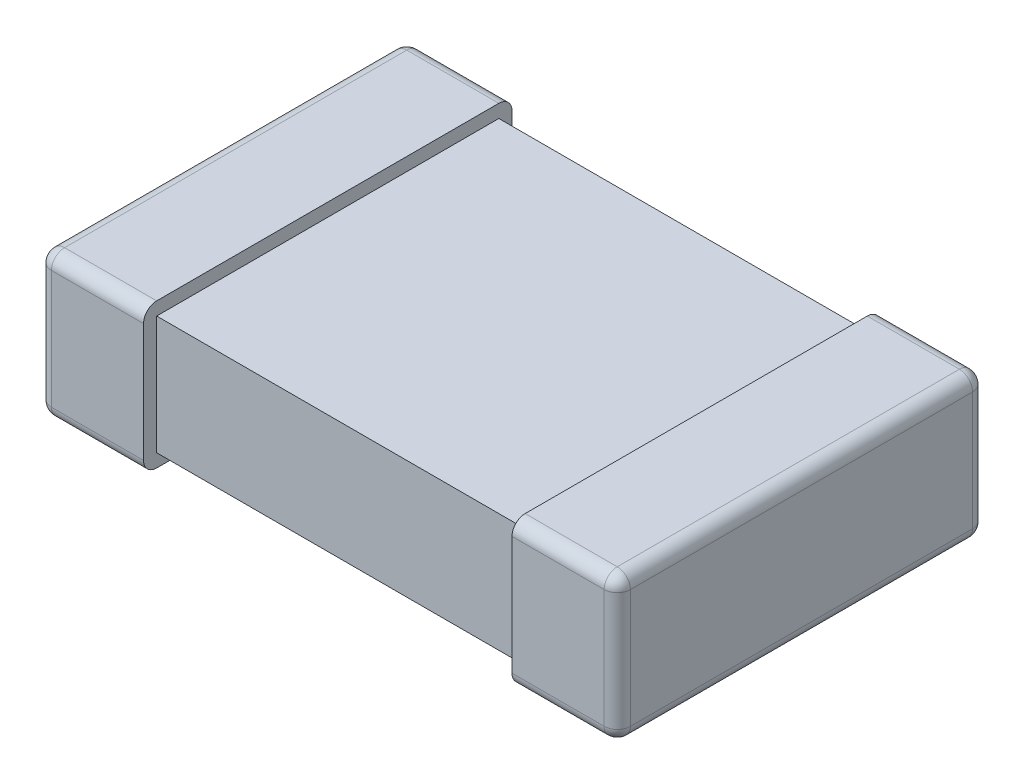
ISO-10303-21;
HEADER;
FILE_DESCRIPTION(('STEP AP214'),'2;1');
FILE_NAME('part.step','',(''),(''),'','','');
FILE_SCHEMA(('AUTOMOTIVE_DESIGN { 1 0 10303 214 1 1 1 1 }'));
ENDSEC;
DATA;
#1=APPLICATION_CONTEXT('core data for automotive mechanical design processes');
#2=APPLICATION_PROTOCOL_DEFINITION('international standard','automotive_design',2000,#1);
#3=PRODUCT_CONTEXT('',#1,'mechanical');
#4=PRODUCT('Part','Part','',(#3));
#5=PRODUCT_RELATED_PRODUCT_CATEGORY('part','',(#4));
#6=PRODUCT_DEFINITION_FORMATION('','',#4);
#7=PRODUCT_DEFINITION_CONTEXT('part definition',#1,'design');
#8=PRODUCT_DEFINITION('design','',#6,#7);
#9=PRODUCT_DEFINITION_SHAPE('','',#8);
#10=(LENGTH_UNIT() NAMED_UNIT(*) SI_UNIT(.MILLI.,.METRE.));
#11=(NAMED_UNIT(*) PLANE_ANGLE_UNIT() SI_UNIT($,.RADIAN.));
#12=(NAMED_UNIT(*) SI_UNIT($,.STERADIAN.) SOLID_ANGLE_UNIT());
#13=UNCERTAINTY_MEASURE_WITH_UNIT(LENGTH_MEASURE(1.E-05),#10,'distance_accuracy_value','');
#14=(GEOMETRIC_REPRESENTATION_CONTEXT(3) GLOBAL_UNCERTAINTY_ASSIGNED_CONTEXT((#13)) GLOBAL_UNIT_ASSIGNED_CONTEXT((#10,
#11,#12)) REPRESENTATION_CONTEXT('',''));
#15=CARTESIAN_POINT('',(0.,0.,0.));
#16=DIRECTION('',(0.,0.,1.));
#17=DIRECTION('',(1.,0.,0.));
#18=AXIS2_PLACEMENT_3D('',#15,#16,#17);
#19=CARTESIAN_POINT('',(1.1,0.55,-0.7));
#20=DIRECTION('',(1.,0.,0.));
#21=DIRECTION('',(0.,0.,-1.));
#22=AXIS2_PLACEMENT_3D('',#19,#20,#21);
#23=PLANE('',#22);
#24=DIRECTION('',(0.,0.,-1.));
#25=VECTOR('',#24,1.);
#26=CARTESIAN_POINT('',(1.1,0.05,-0.65));
#27=LINE('',#26,#25);
#28=CARTESIAN_POINT('',(1.1,0.05,-0.65));
#29=VERTEX_POINT('',#28);
#30=CARTESIAN_POINT('',(1.1,0.05,0.65));
#31=VERTEX_POINT('',#30);
#32=EDGE_CURVE('E675',#29,#31,#27,.F.);
#33=ORIENTED_EDGE('',*,*,#32,.F.);
#34=DIRECTION('',(0.,1.,0.));
#35=VECTOR('',#34,1.);
#36=CARTESIAN_POINT('',(1.1,0.55,-0.65));
#37=LINE('',#36,#35);
#38=CARTESIAN_POINT('',(1.1,0.5,-0.65));
#39=VERTEX_POINT('',#38);
#40=EDGE_CURVE('E676',#29,#39,#37,.T.);
#41=ORIENTED_EDGE('',*,*,#40,.T.);
#42=DIRECTION('',(0.,0.,1.));
#43=VECTOR('',#42,1.);
#44=CARTESIAN_POINT('',(1.1,0.5,-0.7));
#45=LINE('',#44,#43);
#46=CARTESIAN_POINT('',(1.1,0.5,0.65));
#47=VERTEX_POINT('',#46);
#48=EDGE_CURVE('E691',#47,#39,#45,.F.);
#49=ORIENTED_EDGE('',*,*,#48,.F.);
#50=DIRECTION('',(0.,-1.,0.));
#51=VECTOR('',#50,1.);
#52=CARTESIAN_POINT('',(1.1,0.55,0.65));
#53=LINE('',#52,#51);
#54=EDGE_CURVE('E460',#31,#47,#53,.F.);
#55=ORIENTED_EDGE('',*,*,#54,.F.);
#56=EDGE_LOOP('',(#33,#41,#49,#55));
#57=FACE_BOUND('',#56,.T.);
#58=ADVANCED_FACE('F16',(#57),#23,.T.);
#59=CARTESIAN_POINT('',(-1.1,0.55,-0.7));
#60=DIRECTION('',(1.,0.,0.));
#61=DIRECTION('',(0.,0.,-1.));
#62=AXIS2_PLACEMENT_3D('',#59,#60,#61);
#63=PLANE('',#62);
#64=DIRECTION('',(0.,0.,-1.));
#65=VECTOR('',#64,1.);
#66=CARTESIAN_POINT('',(-1.1,0.5,0.7));
#67=LINE('',#66,#65);
#68=CARTESIAN_POINT('',(-1.1,0.5,-0.65));
#69=VERTEX_POINT('',#68);
#70=CARTESIAN_POINT('',(-1.1,0.5,0.65));
#71=VERTEX_POINT('',#70);
#72=EDGE_CURVE('E409',#69,#71,#67,.F.);
#73=ORIENTED_EDGE('',*,*,#72,.F.);
#74=DIRECTION('',(0.,-1.,0.));
#75=VECTOR('',#74,1.);
#76=CARTESIAN_POINT('',(-1.1,0.55,-0.65));
#77=LINE('',#76,#75);
#78=CARTESIAN_POINT('',(-1.1,0.05,-0.65));
#79=VERTEX_POINT('',#78);
#80=EDGE_CURVE('E357',#79,#69,#77,.F.);
#81=ORIENTED_EDGE('',*,*,#80,.F.);
#82=DIRECTION('',(0.,0.,1.));
#83=VECTOR('',#82,1.);
#84=CARTESIAN_POINT('',(-1.1,0.05,-0.7));
#85=LINE('',#84,#83);
#86=CARTESIAN_POINT('',(-1.1,0.05,0.65));
#87=VERTEX_POINT('',#86);
#88=EDGE_CURVE('E665',#87,#79,#85,.F.);
#89=ORIENTED_EDGE('',*,*,#88,.F.);
#90=DIRECTION('',(0.,1.,0.));
#91=VECTOR('',#90,1.);
#92=CARTESIAN_POINT('',(-1.1,0.55,0.65));
#93=LINE('',#92,#91);
#94=EDGE_CURVE('E673',#71,#87,#93,.F.);
#95=ORIENTED_EDGE('',*,*,#94,.F.);
#96=EDGE_LOOP('',(#73,#81,#89,#95));
#97=FACE_BOUND('',#96,.T.);
#98=ADVANCED_FACE('F484',(#97),#63,.F.);
#99=CARTESIAN_POINT('',(1.05,0.05,-0.65));
#100=DIRECTION('',(0.,0.,-1.));
#101=DIRECTION('',(-1.,0.,0.));
#102=AXIS2_PLACEMENT_3D('',#99,#100,#101);
#103=CYLINDRICAL_SURFACE('',#102,0.05);
#104=CARTESIAN_POINT('',(1.05,0.05,0.65));
#105=DIRECTION('',(0.,0.,-1.));
#106=DIRECTION('',(1.,0.,0.));
#107=AXIS2_PLACEMENT_3D('',#104,#105,#106);
#108=CIRCLE('',#107,0.05);
#109=CARTESIAN_POINT('',(1.05,0.,0.65));
#110=VERTEX_POINT('',#109);
#111=EDGE_CURVE('E469',#110,#31,#108,.F.);
#112=ORIENTED_EDGE('',*,*,#111,.F.);
#113=DIRECTION('',(0.,0.,1.));
#114=VECTOR('',#113,1.);
#115=CARTESIAN_POINT('',(1.05,0.,-0.65));
#116=LINE('',#115,#114);
#117=CARTESIAN_POINT('',(1.05,0.,-0.650000000000096));
#118=VERTEX_POINT('',#117);
#119=EDGE_CURVE('E297',#110,#118,#116,.F.);
#120=ORIENTED_EDGE('',*,*,#119,.T.);
#121=CARTESIAN_POINT('',(1.05,0.05,-0.65));
#122=DIRECTION('',(0.,7.66568424341191E-12,-1.));
#123=DIRECTION('',(1.,0.,0.));
#124=AXIS2_PLACEMENT_3D('',#121,#122,#123);
#125=CIRCLE('',#124,0.05);
#126=EDGE_CURVE('E406',#29,#118,#125,.T.);
#127=ORIENTED_EDGE('',*,*,#126,.F.);
#128=ORIENTED_EDGE('',*,*,#32,.T.);
#129=EDGE_LOOP('',(#112,#120,#127,#128));
#130=FACE_BOUND('',#129,.T.);
#131=ADVANCED_FACE('F481',(#130),#103,.T.);
#132=CARTESIAN_POINT('',(1.05,0.05,0.65));
#133=DIRECTION('',(1.,0.,0.));
#134=DIRECTION('',(0.,0.,-1.));
#135=AXIS2_PLACEMENT_3D('',#132,#133,#134);
#136=SPHERICAL_SURFACE('',#135,0.05);
#137=ORIENTED_EDGE('',*,*,#111,.T.);
#138=CARTESIAN_POINT('',(1.05,0.05,0.65));
#139=DIRECTION('',(0.,-1.,0.));
#140=DIRECTION('',(0.,0.,-1.));
#141=AXIS2_PLACEMENT_3D('',#138,#139,#140);
#142=CIRCLE('',#141,0.05);
#143=CARTESIAN_POINT('',(1.05,0.05,0.7));
#144=VERTEX_POINT('',#143);
#145=EDGE_CURVE('E466',#144,#31,#142,.F.);
#146=ORIENTED_EDGE('',*,*,#145,.F.);
#147=CARTESIAN_POINT('',(1.05,0.05,0.65));
#148=DIRECTION('',(1.,0.,0.));
#149=DIRECTION('',(0.,0.,-1.));
#150=AXIS2_PLACEMENT_3D('',#147,#148,#149);
#151=CIRCLE('',#150,0.05);
#152=EDGE_CURVE('E187',#110,#144,#151,.F.);
#153=ORIENTED_EDGE('',*,*,#152,.F.);
#154=EDGE_LOOP('',(#137,#146,#153));
#155=FACE_BOUND('',#154,.T.);
#156=ADVANCED_FACE('F478',(#155),#136,.T.);
#157=CARTESIAN_POINT('',(1.05,0.55,0.65));
#158=DIRECTION('',(0.,-1.,0.));
#159=DIRECTION('',(0.,0.,-1.));
#160=AXIS2_PLACEMENT_3D('',#157,#158,#159);
#161=CYLINDRICAL_SURFACE('',#160,0.05);
#162=ORIENTED_EDGE('',*,*,#145,.T.);
#163=ORIENTED_EDGE('',*,*,#54,.T.);
#164=CARTESIAN_POINT('',(1.05,0.5,0.65));
#165=DIRECTION('',(0.,-1.,0.));
#166=DIRECTION('',(1.,0.,0.));
#167=AXIS2_PLACEMENT_3D('',#164,#165,#166);
#168=CIRCLE('',#167,0.05);
#169=CARTESIAN_POINT('',(1.05,0.5,0.7));
#170=VERTEX_POINT('',#169);
#171=EDGE_CURVE('E456',#170,#47,#168,.F.);
#172=ORIENTED_EDGE('',*,*,#171,.F.);
#173=DIRECTION('',(0.,1.,0.));
#174=VECTOR('',#173,1.);
#175=CARTESIAN_POINT('',(1.05,0.55,0.7));
#176=LINE('',#175,#174);
#177=EDGE_CURVE('E191',#144,#170,#176,.T.);
#178=ORIENTED_EDGE('',*,*,#177,.F.);
#179=EDGE_LOOP('',(#162,#163,#172,#178));
#180=FACE_BOUND('',#179,.T.);
#181=ADVANCED_FACE('F448',(#180),#161,.T.);
#182=CARTESIAN_POINT('',(1.05,0.5,0.65));
#183=DIRECTION('',(1.,0.,0.));
#184=DIRECTION('',(0.,0.,-1.));
#185=AXIS2_PLACEMENT_3D('',#182,#183,#184);
#186=SPHERICAL_SURFACE('',#185,0.05);
#187=CARTESIAN_POINT('',(1.05,0.5,0.65));
#188=DIRECTION('',(-1.,0.,0.));
#189=DIRECTION('',(0.,0.,1.));
#190=AXIS2_PLACEMENT_3D('',#187,#188,#189);
#191=CIRCLE('',#190,0.05);
#192=CARTESIAN_POINT('',(1.05,0.55,0.65));
#193=VERTEX_POINT('',#192);
#194=EDGE_CURVE('E291',#170,#193,#191,.T.);
#195=ORIENTED_EDGE('',*,*,#194,.F.);
#196=ORIENTED_EDGE('',*,*,#171,.T.);
#197=CARTESIAN_POINT('',(1.05,0.5,0.65));
#198=DIRECTION('',(0.,0.,1.));
#199=DIRECTION('',(1.,0.,0.));
#200=AXIS2_PLACEMENT_3D('',#197,#198,#199);
#201=CIRCLE('',#200,0.05);
#202=EDGE_CURVE('E459',#193,#47,#201,.F.);
#203=ORIENTED_EDGE('',*,*,#202,.F.);
#204=EDGE_LOOP('',(#195,#196,#203));
#205=FACE_BOUND('',#204,.T.);
#206=ADVANCED_FACE('F443',(#205),#186,.T.);
#207=CARTESIAN_POINT('',(1.05,0.5,-0.7));
#208=DIRECTION('',(0.,0.,1.));
#209=DIRECTION('',(1.,0.,0.));
#210=AXIS2_PLACEMENT_3D('',#207,#208,#209);
#211=CYLINDRICAL_SURFACE('',#210,0.05);
#212=ORIENTED_EDGE('',*,*,#202,.T.);
#213=ORIENTED_EDGE('',*,*,#48,.T.);
#214=CARTESIAN_POINT('',(1.05,0.5,-0.65));
#215=DIRECTION('',(0.,0.,1.));
#216=DIRECTION('',(1.,0.,0.));
#217=AXIS2_PLACEMENT_3D('',#214,#215,#216);
#218=CIRCLE('',#217,0.05);
#219=CARTESIAN_POINT('',(1.05,0.55,-0.65));
#220=VERTEX_POINT('',#219);
#221=EDGE_CURVE('E428',#220,#39,#218,.F.);
#222=ORIENTED_EDGE('',*,*,#221,.F.);
#223=DIRECTION('',(0.,0.,1.));
#224=VECTOR('',#223,1.);
#225=CARTESIAN_POINT('',(1.05,0.55,0.7));
#226=LINE('',#225,#224);
#227=EDGE_CURVE('E287',#193,#220,#226,.F.);
#228=ORIENTED_EDGE('',*,*,#227,.F.);
#229=EDGE_LOOP('',(#212,#213,#222,#228));
#230=FACE_BOUND('',#229,.T.);
#231=ADVANCED_FACE('F439',(#230),#211,.T.);
#232=CARTESIAN_POINT('',(1.05,0.5,-0.65));
#233=DIRECTION('',(1.,0.,0.));
#234=DIRECTION('',(0.,0.,-1.));
#235=AXIS2_PLACEMENT_3D('',#232,#233,#234);
#236=SPHERICAL_SURFACE('',#235,0.05);
#237=CARTESIAN_POINT('',(1.05,0.5,-0.65));
#238=DIRECTION('',(1.,0.,0.));
#239=DIRECTION('',(0.,0.,-1.));
#240=AXIS2_PLACEMENT_3D('',#237,#238,#239);
#241=CIRCLE('',#240,0.05);
#242=CARTESIAN_POINT('',(1.05,0.5,-0.7));
#243=VERTEX_POINT('',#242);
#244=EDGE_CURVE('E281',#220,#243,#241,.F.);
#245=ORIENTED_EDGE('',*,*,#244,.F.);
#246=ORIENTED_EDGE('',*,*,#221,.T.);
#247=CARTESIAN_POINT('',(1.05,0.5,-0.65));
#248=DIRECTION('',(0.,-1.,0.));
#249=DIRECTION('',(0.,0.,-1.));
#250=AXIS2_PLACEMENT_3D('',#247,#248,#249);
#251=CIRCLE('',#250,0.05);
#252=EDGE_CURVE('E415',#243,#39,#251,.T.);
#253=ORIENTED_EDGE('',*,*,#252,.F.);
#254=EDGE_LOOP('',(#245,#246,#253));
#255=FACE_BOUND('',#254,.T.);
#256=ADVANCED_FACE('F435',(#255),#236,.T.);
#257=CARTESIAN_POINT('',(1.05,0.55,-0.65));
#258=DIRECTION('',(0.,-1.,0.));
#259=DIRECTION('',(0.,0.,-1.));
#260=AXIS2_PLACEMENT_3D('',#257,#258,#259);
#261=CYLINDRICAL_SURFACE('',#260,0.05);
#262=ORIENTED_EDGE('',*,*,#252,.T.);
#263=ORIENTED_EDGE('',*,*,#40,.F.);
#264=CARTESIAN_POINT('',(1.05,0.05,-0.65));
#265=DIRECTION('',(0.,1.,0.));
#266=DIRECTION('',(1.,0.,0.));
#267=AXIS2_PLACEMENT_3D('',#264,#265,#266);
#268=CIRCLE('',#267,0.05);
#269=CARTESIAN_POINT('',(1.05,0.05,-0.7));
#270=VERTEX_POINT('',#269);
#271=EDGE_CURVE('E410',#270,#29,#268,.F.);
#272=ORIENTED_EDGE('',*,*,#271,.F.);
#273=DIRECTION('',(0.,1.,0.));
#274=VECTOR('',#273,1.);
#275=CARTESIAN_POINT('',(1.05,0.55,-0.7));
#276=LINE('',#275,#274);
#277=EDGE_CURVE('E275',#243,#270,#276,.F.);
#278=ORIENTED_EDGE('',*,*,#277,.F.);
#279=EDGE_LOOP('',(#262,#263,#272,#278));
#280=FACE_BOUND('',#279,.T.);
#281=ADVANCED_FACE('F438',(#280),#261,.T.);
#282=CARTESIAN_POINT('',(1.05,0.05,-0.65));
#283=DIRECTION('',(1.,0.,0.));
#284=DIRECTION('',(0.,0.,-1.));
#285=AXIS2_PLACEMENT_3D('',#282,#283,#284);
#286=SPHERICAL_SURFACE('',#285,0.05);
#287=ORIENTED_EDGE('',*,*,#271,.T.);
#288=ORIENTED_EDGE('',*,*,#126,.T.);
#289=CARTESIAN_POINT('',(1.05,0.05,-0.65));
#290=DIRECTION('',(-1.,0.,0.));
#291=DIRECTION('',(0.,0.,1.));
#292=AXIS2_PLACEMENT_3D('',#289,#290,#291);
#293=CIRCLE('',#292,0.05);
#294=EDGE_CURVE('E264',#270,#118,#293,.T.);
#295=ORIENTED_EDGE('',*,*,#294,.F.);
#296=EDGE_LOOP('',(#287,#288,#295));
#297=FACE_BOUND('',#296,.T.);
#298=ADVANCED_FACE('F389',(#297),#286,.T.);
#299=CARTESIAN_POINT('',(-1.05,0.5,0.65));
#300=DIRECTION('',(1.,0.,0.));
#301=DIRECTION('',(0.,0.,-1.));
#302=AXIS2_PLACEMENT_3D('',#299,#300,#301);
#303=SPHERICAL_SURFACE('',#302,0.05);
#304=CARTESIAN_POINT('',(-1.05,0.5,0.65));
#305=DIRECTION('',(0.,0.,-1.));
#306=DIRECTION('',(-1.,0.,0.));
#307=AXIS2_PLACEMENT_3D('',#304,#305,#306);
#308=CIRCLE('',#307,0.05);
#309=CARTESIAN_POINT('',(-1.05,0.55,0.65));
#310=VERTEX_POINT('',#309);
#311=EDGE_CURVE('E685',#71,#310,#308,.T.);
#312=ORIENTED_EDGE('',*,*,#311,.F.);
#313=CARTESIAN_POINT('',(-1.05,0.5,0.65));
#314=DIRECTION('',(0.,-1.,0.));
#315=DIRECTION('',(0.,0.,-1.));
#316=AXIS2_PLACEMENT_3D('',#313,#314,#315);
#317=CIRCLE('',#316,0.05);
#318=CARTESIAN_POINT('',(-1.05,0.5,0.7));
#319=VERTEX_POINT('',#318);
#320=EDGE_CURVE('E307',#319,#71,#317,.T.);
#321=ORIENTED_EDGE('',*,*,#320,.F.);
#322=CARTESIAN_POINT('',(-1.05,0.5,0.65));
#323=DIRECTION('',(-1.,0.,0.));
#324=DIRECTION('',(0.,0.,1.));
#325=AXIS2_PLACEMENT_3D('',#322,#323,#324);
#326=CIRCLE('',#325,0.05);
#327=EDGE_CURVE('E263',#310,#319,#326,.F.);
#328=ORIENTED_EDGE('',*,*,#327,.F.);
#329=EDGE_LOOP('',(#312,#321,#328));
#330=FACE_BOUND('',#329,.T.);
#331=ADVANCED_FACE('F384',(#330),#303,.T.);
#332=CARTESIAN_POINT('',(-1.05,0.5,0.7));
#333=DIRECTION('',(0.,0.,-1.));
#334=DIRECTION('',(-1.,0.,0.));
#335=AXIS2_PLACEMENT_3D('',#332,#333,#334);
#336=CYLINDRICAL_SURFACE('',#335,0.05);
#337=ORIENTED_EDGE('',*,*,#311,.T.);
#338=DIRECTION('',(0.,0.,1.));
#339=VECTOR('',#338,1.);
#340=CARTESIAN_POINT('',(-1.05,0.55,0.7));
#341=LINE('',#340,#339);
#342=CARTESIAN_POINT('',(-1.05,0.55,-0.650000000000096));
#343=VERTEX_POINT('',#342);
#344=EDGE_CURVE('E257',#343,#310,#341,.T.);
#345=ORIENTED_EDGE('',*,*,#344,.F.);
#346=CARTESIAN_POINT('',(-1.05,0.5,-0.65));
#347=DIRECTION('',(0.,7.66592917277174E-12,1.));
#348=DIRECTION('',(1.,0.,0.));
#349=AXIS2_PLACEMENT_3D('',#346,#347,#348);
#350=CIRCLE('',#349,0.05);
#351=EDGE_CURVE('E363',#69,#343,#350,.F.);
#352=ORIENTED_EDGE('',*,*,#351,.F.);
#353=ORIENTED_EDGE('',*,*,#72,.T.);
#354=EDGE_LOOP('',(#337,#345,#352,#353));
#355=FACE_BOUND('',#354,.T.);
#356=ADVANCED_FACE('F380',(#355),#336,.T.);
#357=CARTESIAN_POINT('',(-1.05,0.5,-0.65));
#358=DIRECTION('',(1.,0.,0.));
#359=DIRECTION('',(0.,0.,-1.));
#360=AXIS2_PLACEMENT_3D('',#357,#358,#359);
#361=SPHERICAL_SURFACE('',#360,0.05);
#362=CARTESIAN_POINT('',(-1.05,0.5,-0.65));
#363=DIRECTION('',(0.,-1.,0.));
#364=DIRECTION('',(0.,0.,-1.));
#365=AXIS2_PLACEMENT_3D('',#362,#363,#364);
#366=CIRCLE('',#365,0.05);
#367=CARTESIAN_POINT('',(-1.05,0.5,-0.7));
#368=VERTEX_POINT('',#367);
#369=EDGE_CURVE('E360',#69,#368,#366,.T.);
#370=ORIENTED_EDGE('',*,*,#369,.F.);
#371=ORIENTED_EDGE('',*,*,#351,.T.);
#372=CARTESIAN_POINT('',(-1.05,0.5,-0.65));
#373=DIRECTION('',(1.,0.,0.));
#374=DIRECTION('',(0.,0.,-1.));
#375=AXIS2_PLACEMENT_3D('',#372,#373,#374);
#376=CIRCLE('',#375,0.05);
#377=EDGE_CURVE('E251',#368,#343,#376,.T.);
#378=ORIENTED_EDGE('',*,*,#377,.F.);
#379=EDGE_LOOP('',(#370,#371,#378));
#380=FACE_BOUND('',#379,.T.);
#381=ADVANCED_FACE('F377',(#380),#361,.T.);
#382=CARTESIAN_POINT('',(-1.05,0.55,-0.65));
#383=DIRECTION('',(0.,-1.,0.));
#384=DIRECTION('',(0.,0.,-1.));
#385=AXIS2_PLACEMENT_3D('',#382,#383,#384);
#386=CYLINDRICAL_SURFACE('',#385,0.05);
#387=CARTESIAN_POINT('',(-1.05,0.05,-0.65));
#388=DIRECTION('',(0.,1.,0.));
#389=DIRECTION('',(1.,0.,0.));
#390=AXIS2_PLACEMENT_3D('',#387,#388,#389);
#391=CIRCLE('',#390,0.05);
#392=CARTESIAN_POINT('',(-1.05,0.05,-0.7));
#393=VERTEX_POINT('',#392);
#394=EDGE_CURVE('E353',#79,#393,#391,.F.);
#395=ORIENTED_EDGE('',*,*,#394,.F.);
#396=ORIENTED_EDGE('',*,*,#80,.T.);
#397=ORIENTED_EDGE('',*,*,#369,.T.);
#398=DIRECTION('',(0.,1.,0.));
#399=VECTOR('',#398,1.);
#400=CARTESIAN_POINT('',(-1.05,0.55,-0.7));
#401=LINE('',#400,#399);
#402=EDGE_CURVE('E245',#368,#393,#401,.F.);
#403=ORIENTED_EDGE('',*,*,#402,.T.);
#404=EDGE_LOOP('',(#395,#396,#397,#403));
#405=FACE_BOUND('',#404,.T.);
#406=ADVANCED_FACE('F345',(#405),#386,.T.);
#407=CARTESIAN_POINT('',(-1.05,0.05,-0.65));
#408=DIRECTION('',(1.,0.,0.));
#409=DIRECTION('',(0.,0.,-1.));
#410=AXIS2_PLACEMENT_3D('',#407,#408,#409);
#411=SPHERICAL_SURFACE('',#410,0.05);
#412=CARTESIAN_POINT('',(-1.05,0.05,-0.65));
#413=DIRECTION('',(-1.,0.,0.));
#414=DIRECTION('',(0.,0.,1.));
#415=AXIS2_PLACEMENT_3D('',#412,#413,#414);
#416=CIRCLE('',#415,0.05);
#417=CARTESIAN_POINT('',(-1.05,0.,-0.65));
#418=VERTEX_POINT('',#417);
#419=EDGE_CURVE('E239',#418,#393,#416,.F.);
#420=ORIENTED_EDGE('',*,*,#419,.F.);
#421=CARTESIAN_POINT('',(-1.05,0.05,-0.65));
#422=DIRECTION('',(0.,0.,1.));
#423=DIRECTION('',(1.,0.,0.));
#424=AXIS2_PLACEMENT_3D('',#421,#422,#423);
#425=CIRCLE('',#424,0.05);
#426=EDGE_CURVE('E356',#79,#418,#425,.T.);
#427=ORIENTED_EDGE('',*,*,#426,.F.);
#428=ORIENTED_EDGE('',*,*,#394,.T.);
#429=EDGE_LOOP('',(#420,#427,#428));
#430=FACE_BOUND('',#429,.T.);
#431=ADVANCED_FACE('F340',(#430),#411,.T.);
#432=CARTESIAN_POINT('',(-1.05,0.05,-0.7));
#433=DIRECTION('',(0.,0.,1.));
#434=DIRECTION('',(1.,0.,0.));
#435=AXIS2_PLACEMENT_3D('',#432,#433,#434);
#436=CYLINDRICAL_SURFACE('',#435,0.05);
#437=CARTESIAN_POINT('',(-1.05,0.05,0.65));
#438=DIRECTION('',(0.,-7.66605163745165E-12,-1.));
#439=DIRECTION('',(1.,0.,0.));
#440=AXIS2_PLACEMENT_3D('',#437,#438,#439);
#441=CIRCLE('',#440,0.05);
#442=CARTESIAN_POINT('',(-1.05,0.,0.650000000000096));
#443=VERTEX_POINT('',#442);
#444=EDGE_CURVE('E320',#87,#443,#441,.F.);
#445=ORIENTED_EDGE('',*,*,#444,.F.);
#446=ORIENTED_EDGE('',*,*,#88,.T.);
#447=ORIENTED_EDGE('',*,*,#426,.T.);
#448=DIRECTION('',(0.,0.,1.));
#449=VECTOR('',#448,1.);
#450=CARTESIAN_POINT('',(-1.05,0.,-0.65));
#451=LINE('',#450,#449);
#452=EDGE_CURVE('E233',#418,#443,#451,.T.);
#453=ORIENTED_EDGE('',*,*,#452,.T.);
#454=EDGE_LOOP('',(#445,#446,#447,#453));
#455=FACE_BOUND('',#454,.T.);
#456=ADVANCED_FACE('F335',(#455),#436,.T.);
#457=CARTESIAN_POINT('',(-1.05,0.05,0.65));
#458=DIRECTION('',(1.,0.,0.));
#459=DIRECTION('',(0.,0.,-1.));
#460=AXIS2_PLACEMENT_3D('',#457,#458,#459);
#461=SPHERICAL_SURFACE('',#460,0.05);
#462=CARTESIAN_POINT('',(-1.05,0.05,0.65));
#463=DIRECTION('',(1.,0.,0.));
#464=DIRECTION('',(0.,0.,-1.));
#465=AXIS2_PLACEMENT_3D('',#462,#463,#464);
#466=CIRCLE('',#465,0.05);
#467=CARTESIAN_POINT('',(-1.05,0.05,0.7));
#468=VERTEX_POINT('',#467);
#469=EDGE_CURVE('E227',#468,#443,#466,.T.);
#470=ORIENTED_EDGE('',*,*,#469,.F.);
#471=CARTESIAN_POINT('',(-1.05,0.05,0.65));
#472=DIRECTION('',(0.,-1.,0.));
#473=DIRECTION('',(0.,0.,-1.));
#474=AXIS2_PLACEMENT_3D('',#471,#472,#473);
#475=CIRCLE('',#474,0.05);
#476=EDGE_CURVE('E304',#87,#468,#475,.F.);
#477=ORIENTED_EDGE('',*,*,#476,.F.);
#478=ORIENTED_EDGE('',*,*,#444,.T.);
#479=EDGE_LOOP('',(#470,#477,#478));
#480=FACE_BOUND('',#479,.T.);
#481=ADVANCED_FACE('F330',(#480),#461,.T.);
#482=CARTESIAN_POINT('',(-1.05,0.55,0.65));
#483=DIRECTION('',(0.,-1.,0.));
#484=DIRECTION('',(0.,0.,-1.));
#485=AXIS2_PLACEMENT_3D('',#482,#483,#484);
#486=CYLINDRICAL_SURFACE('',#485,0.05);
#487=ORIENTED_EDGE('',*,*,#476,.T.);
#488=DIRECTION('',(0.,1.,0.));
#489=VECTOR('',#488,1.);
#490=CARTESIAN_POINT('',(-1.05,0.55,0.7));
#491=LINE('',#490,#489);
#492=EDGE_CURVE('E211',#468,#319,#491,.T.);
#493=ORIENTED_EDGE('',*,*,#492,.T.);
#494=ORIENTED_EDGE('',*,*,#320,.T.);
#495=ORIENTED_EDGE('',*,*,#94,.T.);
#496=EDGE_LOOP('',(#487,#493,#494,#495));
#497=FACE_BOUND('',#496,.T.);
#498=ADVANCED_FACE('F334',(#497),#486,.T.);
#499=CARTESIAN_POINT('',(-1.05,0.,-0.65));
#500=DIRECTION('',(0.,1.,0.));
#501=DIRECTION('',(0.,0.,1.));
#502=AXIS2_PLACEMENT_3D('',#499,#500,#501);
#503=PLANE('',#502);
#504=DIRECTION('',(0.,0.,1.));
#505=VECTOR('',#504,1.);
#506=CARTESIAN_POINT('',(0.7,0.,-0.7));
#507=LINE('',#506,#505);
#508=CARTESIAN_POINT('',(0.7,0.,-0.65));
#509=VERTEX_POINT('',#508);
#510=CARTESIAN_POINT('',(0.7,0.,0.65));
#511=VERTEX_POINT('',#510);
#512=EDGE_CURVE('E207',#509,#511,#507,.T.);
#513=ORIENTED_EDGE('',*,*,#512,.F.);
#514=DIRECTION('',(-1.,0.,0.));
#515=VECTOR('',#514,1.);
#516=CARTESIAN_POINT('',(-1.05,0.,-0.65));
#517=LINE('',#516,#515);
#518=EDGE_CURVE('E260',#118,#509,#517,.T.);
#519=ORIENTED_EDGE('',*,*,#518,.F.);
#520=ORIENTED_EDGE('',*,*,#119,.F.);
#521=DIRECTION('',(1.,0.,0.));
#522=VECTOR('',#521,1.);
#523=CARTESIAN_POINT('',(-1.05,0.,0.65));
#524=LINE('',#523,#522);
#525=EDGE_CURVE('E175',#511,#110,#524,.T.);
#526=ORIENTED_EDGE('',*,*,#525,.F.);
#527=EDGE_LOOP('',(#513,#519,#520,#526));
#528=FACE_BOUND('',#527,.T.);
#529=ADVANCED_FACE('F574',(#528),#503,.F.);
#530=CARTESIAN_POINT('',(-1.05,0.05,0.65));
#531=DIRECTION('',(1.,0.,0.));
#532=DIRECTION('',(0.,0.,-1.));
#533=AXIS2_PLACEMENT_3D('',#530,#531,#532);
#534=CYLINDRICAL_SURFACE('',#533,0.05);
#535=ORIENTED_EDGE('',*,*,#152,.T.);
#536=DIRECTION('',(1.,0.,0.));
#537=VECTOR('',#536,1.);
#538=CARTESIAN_POINT('',(1.1,0.05,0.7));
#539=LINE('',#538,#537);
#540=CARTESIAN_POINT('',(0.7,0.05,0.7));
#541=VERTEX_POINT('',#540);
#542=EDGE_CURVE('E181',#541,#144,#539,.T.);
#543=ORIENTED_EDGE('',*,*,#542,.F.);
#544=CARTESIAN_POINT('',(0.7,0.05,0.65));
#545=DIRECTION('',(1.,0.,0.));
#546=DIRECTION('',(0.,0.,-1.));
#547=AXIS2_PLACEMENT_3D('',#544,#545,#546);
#548=CIRCLE('',#547,0.05);
#549=EDGE_CURVE('E19',#511,#541,#548,.F.);
#550=ORIENTED_EDGE('',*,*,#549,.F.);
#551=ORIENTED_EDGE('',*,*,#525,.T.);
#552=EDGE_LOOP('',(#535,#543,#550,#551));
#553=FACE_BOUND('',#552,.T.);
#554=ADVANCED_FACE('F183',(#553),#534,.T.);
#555=CARTESIAN_POINT('',(1.1,0.55,0.7));
#556=DIRECTION('',(0.,0.,1.));
#557=DIRECTION('',(1.,0.,0.));
#558=AXIS2_PLACEMENT_3D('',#555,#556,#557);
#559=PLANE('',#558);
#560=ORIENTED_EDGE('',*,*,#177,.T.);
#561=DIRECTION('',(-1.,0.,0.));
#562=VECTOR('',#561,1.);
#563=CARTESIAN_POINT('',(1.1,0.5,0.7));
#564=LINE('',#563,#562);
#565=CARTESIAN_POINT('',(0.7,0.5,0.7));
#566=VERTEX_POINT('',#565);
#567=EDGE_CURVE('E197',#566,#170,#564,.F.);
#568=ORIENTED_EDGE('',*,*,#567,.F.);
#569=DIRECTION('',(0.,1.,0.));
#570=VECTOR('',#569,1.);
#571=CARTESIAN_POINT('',(0.7,0.55,0.7));
#572=LINE('',#571,#570);
#573=EDGE_CURVE('E194',#541,#566,#572,.T.);
#574=ORIENTED_EDGE('',*,*,#573,.F.);
#575=ORIENTED_EDGE('',*,*,#542,.T.);
#576=EDGE_LOOP('',(#560,#568,#574,#575));
#577=FACE_BOUND('',#576,.T.);
#578=ADVANCED_FACE('F195',(#577),#559,.T.);
#579=CARTESIAN_POINT('',(1.1,0.5,0.65));
#580=DIRECTION('',(-1.,0.,0.));
#581=DIRECTION('',(0.,0.,1.));
#582=AXIS2_PLACEMENT_3D('',#579,#580,#581);
#583=CYLINDRICAL_SURFACE('',#582,0.05);
#584=ORIENTED_EDGE('',*,*,#194,.T.);
#585=DIRECTION('',(1.,0.,0.));
#586=VECTOR('',#585,1.);
#587=CARTESIAN_POINT('',(1.1,0.55,0.65));
#588=LINE('',#587,#586);
#589=CARTESIAN_POINT('',(0.7,0.55,0.65));
#590=VERTEX_POINT('',#589);
#591=EDGE_CURVE('E282',#590,#193,#588,.T.);
#592=ORIENTED_EDGE('',*,*,#591,.F.);
#593=CARTESIAN_POINT('',(0.7,0.5,0.65));
#594=DIRECTION('',(-1.,0.,0.));
#595=DIRECTION('',(0.,0.,1.));
#596=AXIS2_PLACEMENT_3D('',#593,#594,#595);
#597=CIRCLE('',#596,0.05);
#598=EDGE_CURVE('E201',#566,#590,#597,.T.);
#599=ORIENTED_EDGE('',*,*,#598,.F.);
#600=ORIENTED_EDGE('',*,*,#567,.T.);
#601=EDGE_LOOP('',(#584,#592,#599,#600));
#602=FACE_BOUND('',#601,.T.);
#603=ADVANCED_FACE('F566',(#602),#583,.T.);
#604=CARTESIAN_POINT('',(1.1,0.55,0.7));
#605=DIRECTION('',(0.,1.,0.));
#606=DIRECTION('',(0.,0.,1.));
#607=AXIS2_PLACEMENT_3D('',#604,#605,#606);
#608=PLANE('',#607);
#609=DIRECTION('',(0.,0.,1.));
#610=VECTOR('',#609,1.);
#611=CARTESIAN_POINT('',(0.7,0.55,-0.7));
#612=LINE('',#611,#610);
#613=CARTESIAN_POINT('',(0.7,0.55,-0.65));
#614=VERTEX_POINT('',#613);
#615=EDGE_CURVE('E597',#590,#614,#612,.F.);
#616=ORIENTED_EDGE('',*,*,#615,.F.);
#617=ORIENTED_EDGE('',*,*,#591,.T.);
#618=ORIENTED_EDGE('',*,*,#227,.T.);
#619=DIRECTION('',(1.,0.,0.));
#620=VECTOR('',#619,1.);
#621=CARTESIAN_POINT('',(1.1,0.55,-0.65));
#622=LINE('',#621,#620);
#623=EDGE_CURVE('E278',#614,#220,#622,.T.);
#624=ORIENTED_EDGE('',*,*,#623,.F.);
#625=EDGE_LOOP('',(#616,#617,#618,#624));
#626=FACE_BOUND('',#625,.T.);
#627=ADVANCED_FACE('F562',(#626),#608,.T.);
#628=CARTESIAN_POINT('',(1.1,0.5,-0.65));
#629=DIRECTION('',(1.,0.,0.));
#630=DIRECTION('',(0.,0.,-1.));
#631=AXIS2_PLACEMENT_3D('',#628,#629,#630);
#632=CYLINDRICAL_SURFACE('',#631,0.05);
#633=ORIENTED_EDGE('',*,*,#244,.T.);
#634=DIRECTION('',(-1.,0.,0.));
#635=VECTOR('',#634,1.);
#636=CARTESIAN_POINT('',(1.1,0.5,-0.7));
#637=LINE('',#636,#635);
#638=CARTESIAN_POINT('',(0.7,0.5,-0.7));
#639=VERTEX_POINT('',#638);
#640=EDGE_CURVE('E270',#639,#243,#637,.F.);
#641=ORIENTED_EDGE('',*,*,#640,.F.);
#642=CARTESIAN_POINT('',(0.7,0.5,-0.65));
#643=DIRECTION('',(1.,0.,0.));
#644=DIRECTION('',(0.,0.,-1.));
#645=AXIS2_PLACEMENT_3D('',#642,#643,#644);
#646=CIRCLE('',#645,0.05);
#647=EDGE_CURVE('E591',#614,#639,#646,.F.);
#648=ORIENTED_EDGE('',*,*,#647,.F.);
#649=ORIENTED_EDGE('',*,*,#623,.T.);
#650=EDGE_LOOP('',(#633,#641,#648,#649));
#651=FACE_BOUND('',#650,.T.);
#652=ADVANCED_FACE('F558',(#651),#632,.T.);
#653=CARTESIAN_POINT('',(1.1,0.55,-0.7));
#654=DIRECTION('',(0.,0.,-1.));
#655=DIRECTION('',(-1.,0.,0.));
#656=AXIS2_PLACEMENT_3D('',#653,#654,#655);
#657=PLANE('',#656);
#658=DIRECTION('',(0.,1.,0.));
#659=VECTOR('',#658,1.);
#660=CARTESIAN_POINT('',(0.7,0.55,-0.7));
#661=LINE('',#660,#659);
#662=CARTESIAN_POINT('',(0.7,0.05,-0.7));
#663=VERTEX_POINT('',#662);
#664=EDGE_CURVE('E586',#639,#663,#661,.F.);
#665=ORIENTED_EDGE('',*,*,#664,.F.);
#666=ORIENTED_EDGE('',*,*,#640,.T.);
#667=ORIENTED_EDGE('',*,*,#277,.T.);
#668=DIRECTION('',(-1.,0.,0.));
#669=VECTOR('',#668,1.);
#670=CARTESIAN_POINT('',(-1.05,0.05,-0.7));
#671=LINE('',#670,#669);
#672=EDGE_CURVE('E267',#663,#270,#671,.F.);
#673=ORIENTED_EDGE('',*,*,#672,.F.);
#674=EDGE_LOOP('',(#665,#666,#667,#673));
#675=FACE_BOUND('',#674,.T.);
#676=ADVANCED_FACE('F554',(#675),#657,.T.);
#677=CARTESIAN_POINT('',(-1.05,0.05,-0.65));
#678=DIRECTION('',(-1.,0.,0.));
#679=DIRECTION('',(0.,0.,1.));
#680=AXIS2_PLACEMENT_3D('',#677,#678,#679);
#681=CYLINDRICAL_SURFACE('',#680,0.05);
#682=ORIENTED_EDGE('',*,*,#294,.T.);
#683=ORIENTED_EDGE('',*,*,#518,.T.);
#684=CARTESIAN_POINT('',(0.7,0.05,-0.65));
#685=DIRECTION('',(-1.,0.,0.));
#686=DIRECTION('',(0.,0.,1.));
#687=AXIS2_PLACEMENT_3D('',#684,#685,#686);
#688=CIRCLE('',#687,0.05);
#689=EDGE_CURVE('E582',#663,#509,#688,.T.);
#690=ORIENTED_EDGE('',*,*,#689,.F.);
#691=ORIENTED_EDGE('',*,*,#672,.T.);
#692=EDGE_LOOP('',(#682,#683,#690,#691));
#693=FACE_BOUND('',#692,.T.);
#694=ADVANCED_FACE('F550',(#693),#681,.T.);
#695=CARTESIAN_POINT('',(-1.1,0.5,0.65));
#696=DIRECTION('',(-1.,0.,0.));
#697=DIRECTION('',(0.,0.,1.));
#698=AXIS2_PLACEMENT_3D('',#695,#696,#697);
#699=CYLINDRICAL_SURFACE('',#698,0.05);
#700=ORIENTED_EDGE('',*,*,#327,.T.);
#701=DIRECTION('',(-1.,0.,0.));
#702=VECTOR('',#701,1.);
#703=CARTESIAN_POINT('',(-1.1,0.5,0.7));
#704=LINE('',#703,#702);
#705=CARTESIAN_POINT('',(-0.7,0.5,0.7));
#706=VERTEX_POINT('',#705);
#707=EDGE_CURVE('E218',#319,#706,#704,.F.);
#708=ORIENTED_EDGE('',*,*,#707,.T.);
#709=CARTESIAN_POINT('',(-0.7,0.5,0.65));
#710=DIRECTION('',(-1.,0.,0.));
#711=DIRECTION('',(0.,0.,1.));
#712=AXIS2_PLACEMENT_3D('',#709,#710,#711);
#713=CIRCLE('',#712,0.05);
#714=CARTESIAN_POINT('',(-0.7,0.55,0.65));
#715=VERTEX_POINT('',#714);
#716=EDGE_CURVE('E595',#706,#715,#713,.T.);
#717=ORIENTED_EDGE('',*,*,#716,.T.);
#718=DIRECTION('',(1.,0.,0.));
#719=VECTOR('',#718,1.);
#720=CARTESIAN_POINT('',(-1.1,0.55,0.65));
#721=LINE('',#720,#719);
#722=EDGE_CURVE('E254',#310,#715,#721,.T.);
#723=ORIENTED_EDGE('',*,*,#722,.F.);
#724=EDGE_LOOP('',(#700,#708,#717,#723));
#725=FACE_BOUND('',#724,.T.);
#726=ADVANCED_FACE('F546',(#725),#699,.T.);
#727=CARTESIAN_POINT('',(-1.1,0.55,0.7));
#728=DIRECTION('',(0.,1.,0.));
#729=DIRECTION('',(0.,0.,1.));
#730=AXIS2_PLACEMENT_3D('',#727,#728,#729);
#731=PLANE('',#730);
#732=ORIENTED_EDGE('',*,*,#344,.T.);
#733=ORIENTED_EDGE('',*,*,#722,.T.);
#734=DIRECTION('',(0.,0.,1.));
#735=VECTOR('',#734,1.);
#736=CARTESIAN_POINT('',(-0.7,0.55,-0.7));
#737=LINE('',#736,#735);
#738=CARTESIAN_POINT('',(-0.7,0.55,-0.65));
#739=VERTEX_POINT('',#738);
#740=EDGE_CURVE('E607',#715,#739,#737,.F.);
#741=ORIENTED_EDGE('',*,*,#740,.T.);
#742=DIRECTION('',(1.,0.,0.));
#743=VECTOR('',#742,1.);
#744=CARTESIAN_POINT('',(-1.1,0.55,-0.65));
#745=LINE('',#744,#743);
#746=EDGE_CURVE('E246',#343,#739,#745,.T.);
#747=ORIENTED_EDGE('',*,*,#746,.F.);
#748=EDGE_LOOP('',(#732,#733,#741,#747));
#749=FACE_BOUND('',#748,.T.);
#750=ADVANCED_FACE('F542',(#749),#731,.T.);
#751=CARTESIAN_POINT('',(-1.1,0.5,-0.65));
#752=DIRECTION('',(1.,0.,0.));
#753=DIRECTION('',(0.,0.,-1.));
#754=AXIS2_PLACEMENT_3D('',#751,#752,#753);
#755=CYLINDRICAL_SURFACE('',#754,0.05);
#756=ORIENTED_EDGE('',*,*,#377,.T.);
#757=ORIENTED_EDGE('',*,*,#746,.T.);
#758=CARTESIAN_POINT('',(-0.7,0.5,-0.65));
#759=DIRECTION('',(1.,0.,0.));
#760=DIRECTION('',(0.,0.,-1.));
#761=AXIS2_PLACEMENT_3D('',#758,#759,#760);
#762=CIRCLE('',#761,0.05);
#763=CARTESIAN_POINT('',(-0.7,0.5,-0.7));
#764=VERTEX_POINT('',#763);
#765=EDGE_CURVE('E609',#739,#764,#762,.F.);
#766=ORIENTED_EDGE('',*,*,#765,.T.);
#767=DIRECTION('',(1.,0.,0.));
#768=VECTOR('',#767,1.);
#769=CARTESIAN_POINT('',(-1.1,0.5,-0.7));
#770=LINE('',#769,#768);
#771=EDGE_CURVE('E242',#764,#368,#770,.F.);
#772=ORIENTED_EDGE('',*,*,#771,.T.);
#773=EDGE_LOOP('',(#756,#757,#766,#772));
#774=FACE_BOUND('',#773,.T.);
#775=ADVANCED_FACE('F538',(#774),#755,.T.);
#776=CARTESIAN_POINT('',(-1.1,0.55,-0.7));
#777=DIRECTION('',(0.,0.,1.));
#778=DIRECTION('',(1.,0.,0.));
#779=AXIS2_PLACEMENT_3D('',#776,#777,#778);
#780=PLANE('',#779);
#781=DIRECTION('',(-1.,0.,0.));
#782=VECTOR('',#781,1.);
#783=CARTESIAN_POINT('',(-1.1,0.05,-0.7));
#784=LINE('',#783,#782);
#785=CARTESIAN_POINT('',(-0.7,0.05,-0.7));
#786=VERTEX_POINT('',#785);
#787=EDGE_CURVE('E236',#393,#786,#784,.F.);
#788=ORIENTED_EDGE('',*,*,#787,.F.);
#789=ORIENTED_EDGE('',*,*,#402,.F.);
#790=ORIENTED_EDGE('',*,*,#771,.F.);
#791=DIRECTION('',(0.,1.,0.));
#792=VECTOR('',#791,1.);
#793=CARTESIAN_POINT('',(-0.7,0.55,-0.7));
#794=LINE('',#793,#792);
#795=EDGE_CURVE('E610',#764,#786,#794,.F.);
#796=ORIENTED_EDGE('',*,*,#795,.T.);
#797=EDGE_LOOP('',(#788,#789,#790,#796));
#798=FACE_BOUND('',#797,.T.);
#799=ADVANCED_FACE('F534',(#798),#780,.F.);
#800=CARTESIAN_POINT('',(-1.1,0.05,-0.65));
#801=DIRECTION('',(-1.,0.,0.));
#802=DIRECTION('',(0.,0.,1.));
#803=AXIS2_PLACEMENT_3D('',#800,#801,#802);
#804=CYLINDRICAL_SURFACE('',#803,0.05);
#805=ORIENTED_EDGE('',*,*,#419,.T.);
#806=ORIENTED_EDGE('',*,*,#787,.T.);
#807=CARTESIAN_POINT('',(-0.7,0.05,-0.65));
#808=DIRECTION('',(-1.,0.,0.));
#809=DIRECTION('',(0.,0.,1.));
#810=AXIS2_PLACEMENT_3D('',#807,#808,#809);
#811=CIRCLE('',#810,0.05);
#812=CARTESIAN_POINT('',(-0.7,0.,-0.65));
#813=VERTEX_POINT('',#812);
#814=EDGE_CURVE('E612',#786,#813,#811,.T.);
#815=ORIENTED_EDGE('',*,*,#814,.T.);
#816=DIRECTION('',(1.,0.,0.));
#817=VECTOR('',#816,1.);
#818=CARTESIAN_POINT('',(-1.05,0.,-0.65));
#819=LINE('',#818,#817);
#820=EDGE_CURVE('E230',#813,#418,#819,.F.);
#821=ORIENTED_EDGE('',*,*,#820,.T.);
#822=EDGE_LOOP('',(#805,#806,#815,#821));
#823=FACE_BOUND('',#822,.T.);
#824=ADVANCED_FACE('F530',(#823),#804,.T.);
#825=CARTESIAN_POINT('',(-1.05,0.,-0.65));
#826=DIRECTION('',(0.,1.,0.));
#827=DIRECTION('',(0.,0.,1.));
#828=AXIS2_PLACEMENT_3D('',#825,#826,#827);
#829=PLANE('',#828);
#830=DIRECTION('',(0.,0.,1.));
#831=VECTOR('',#830,1.);
#832=CARTESIAN_POINT('',(-0.7,0.,-0.7));
#833=LINE('',#832,#831);
#834=CARTESIAN_POINT('',(-0.7,0.,0.65));
#835=VERTEX_POINT('',#834);
#836=EDGE_CURVE('E613',#813,#835,#833,.T.);
#837=ORIENTED_EDGE('',*,*,#836,.T.);
#838=DIRECTION('',(1.,0.,0.));
#839=VECTOR('',#838,1.);
#840=CARTESIAN_POINT('',(-1.1,0.,0.65));
#841=LINE('',#840,#839);
#842=EDGE_CURVE('E222',#443,#835,#841,.T.);
#843=ORIENTED_EDGE('',*,*,#842,.F.);
#844=ORIENTED_EDGE('',*,*,#452,.F.);
#845=ORIENTED_EDGE('',*,*,#820,.F.);
#846=EDGE_LOOP('',(#837,#843,#844,#845));
#847=FACE_BOUND('',#846,.T.);
#848=ADVANCED_FACE('F526',(#847),#829,.F.);
#849=CARTESIAN_POINT('',(-1.1,0.05,0.65));
#850=DIRECTION('',(1.,0.,0.));
#851=DIRECTION('',(0.,0.,-1.));
#852=AXIS2_PLACEMENT_3D('',#849,#850,#851);
#853=CYLINDRICAL_SURFACE('',#852,0.05);
#854=ORIENTED_EDGE('',*,*,#469,.T.);
#855=ORIENTED_EDGE('',*,*,#842,.T.);
#856=CARTESIAN_POINT('',(-0.7,0.05,0.65));
#857=DIRECTION('',(1.,0.,0.));
#858=DIRECTION('',(0.,0.,-1.));
#859=AXIS2_PLACEMENT_3D('',#856,#857,#858);
#860=CIRCLE('',#859,0.05);
#861=CARTESIAN_POINT('',(-0.7,0.05,0.7));
#862=VERTEX_POINT('',#861);
#863=EDGE_CURVE('E615',#835,#862,#860,.F.);
#864=ORIENTED_EDGE('',*,*,#863,.T.);
#865=DIRECTION('',(-1.,0.,0.));
#866=VECTOR('',#865,1.);
#867=CARTESIAN_POINT('',(-1.1,0.05,0.7));
#868=LINE('',#867,#866);
#869=EDGE_CURVE('E215',#862,#468,#868,.T.);
#870=ORIENTED_EDGE('',*,*,#869,.T.);
#871=EDGE_LOOP('',(#854,#855,#864,#870));
#872=FACE_BOUND('',#871,.T.);
#873=ADVANCED_FACE('F522',(#872),#853,.T.);
#874=CARTESIAN_POINT('',(-1.1,0.55,0.7));
#875=DIRECTION('',(0.,0.,-1.));
#876=DIRECTION('',(-1.,0.,0.));
#877=AXIS2_PLACEMENT_3D('',#874,#875,#876);
#878=PLANE('',#877);
#879=ORIENTED_EDGE('',*,*,#869,.F.);
#880=DIRECTION('',(0.,1.,0.));
#881=VECTOR('',#880,1.);
#882=CARTESIAN_POINT('',(-0.7,0.55,0.7));
#883=LINE('',#882,#881);
#884=EDGE_CURVE('E616',#862,#706,#883,.T.);
#885=ORIENTED_EDGE('',*,*,#884,.T.);
#886=ORIENTED_EDGE('',*,*,#707,.F.);
#887=ORIENTED_EDGE('',*,*,#492,.F.);
#888=EDGE_LOOP('',(#879,#885,#886,#887));
#889=FACE_BOUND('',#888,.T.);
#890=ADVANCED_FACE('F518',(#889),#878,.F.);
#891=CARTESIAN_POINT('',(-0.7,0.05,-0.7));
#892=DIRECTION('',(0.,1.,0.));
#893=DIRECTION('',(0.,0.,1.));
#894=AXIS2_PLACEMENT_3D('',#891,#892,#893);
#895=PLANE('',#894);
#896=DIRECTION('',(1.,0.,0.));
#897=VECTOR('',#896,1.);
#898=CARTESIAN_POINT('',(1.05,0.05,-0.65));
#899=LINE('',#898,#897);
#900=CARTESIAN_POINT('',(-0.7,0.05,-0.65));
#901=VERTEX_POINT('',#900);
#902=CARTESIAN_POINT('',(0.7,0.05,-0.65));
#903=VERTEX_POINT('',#902);
#904=EDGE_CURVE('E587',#901,#903,#899,.T.);
#905=ORIENTED_EDGE('',*,*,#904,.T.);
#906=DIRECTION('',(0.,0.,1.));
#907=VECTOR('',#906,1.);
#908=CARTESIAN_POINT('',(0.7,0.05,-0.7));
#909=LINE('',#908,#907);
#910=CARTESIAN_POINT('',(0.7,0.05,0.65));
#911=VERTEX_POINT('',#910);
#912=EDGE_CURVE('E208',#911,#903,#909,.F.);
#913=ORIENTED_EDGE('',*,*,#912,.F.);
#914=DIRECTION('',(-1.,0.,0.));
#915=VECTOR('',#914,1.);
#916=CARTESIAN_POINT('',(1.05,0.05,0.65));
#917=LINE('',#916,#915);
#918=CARTESIAN_POINT('',(-0.7,0.05,0.65));
#919=VERTEX_POINT('',#918);
#920=EDGE_CURVE('E622',#911,#919,#917,.T.);
#921=ORIENTED_EDGE('',*,*,#920,.T.);
#922=DIRECTION('',(0.,0.,1.));
#923=VECTOR('',#922,1.);
#924=CARTESIAN_POINT('',(-0.7,0.05,-0.7));
#925=LINE('',#924,#923);
#926=EDGE_CURVE('E604',#919,#901,#925,.F.);
#927=ORIENTED_EDGE('',*,*,#926,.T.);
#928=EDGE_LOOP('',(#905,#913,#921,#927));
#929=FACE_BOUND('',#928,.T.);
#930=ADVANCED_FACE('F515',(#929),#895,.F.);
#931=CARTESIAN_POINT('',(0.7,0.55,-0.7));
#932=DIRECTION('',(-1.,0.,0.));
#933=DIRECTION('',(0.,0.,1.));
#934=AXIS2_PLACEMENT_3D('',#931,#932,#933);
#935=PLANE('',#934);
#936=ORIENTED_EDGE('',*,*,#664,.T.);
#937=ORIENTED_EDGE('',*,*,#689,.T.);
#938=ORIENTED_EDGE('',*,*,#512,.T.);
#939=ORIENTED_EDGE('',*,*,#549,.T.);
#940=ORIENTED_EDGE('',*,*,#573,.T.);
#941=ORIENTED_EDGE('',*,*,#598,.T.);
#942=ORIENTED_EDGE('',*,*,#615,.T.);
#943=ORIENTED_EDGE('',*,*,#647,.T.);
#944=EDGE_LOOP('',(#936,#937,#938,#939,#940,#941,#942,#943));
#945=FACE_BOUND('',#944,.T.);
#946=DIRECTION('',(0.,1.,0.));
#947=VECTOR('',#946,1.);
#948=CARTESIAN_POINT('',(0.7,0.5,-0.65));
#949=LINE('',#948,#947);
#950=CARTESIAN_POINT('',(0.7,0.5,-0.65));
#951=VERTEX_POINT('',#950);
#952=EDGE_CURVE('E589',#903,#951,#949,.T.);
#953=ORIENTED_EDGE('',*,*,#952,.T.);
#954=DIRECTION('',(0.,0.,1.));
#955=VECTOR('',#954,1.);
#956=CARTESIAN_POINT('',(0.7,0.5,-0.65));
#957=LINE('',#956,#955);
#958=CARTESIAN_POINT('',(0.7,0.5,0.65));
#959=VERTEX_POINT('',#958);
#960=EDGE_CURVE('E625',#959,#951,#957,.F.);
#961=ORIENTED_EDGE('',*,*,#960,.F.);
#962=DIRECTION('',(0.,1.,0.));
#963=VECTOR('',#962,1.);
#964=CARTESIAN_POINT('',(0.7,0.5,0.65));
#965=LINE('',#964,#963);
#966=EDGE_CURVE('E619',#959,#911,#965,.F.);
#967=ORIENTED_EDGE('',*,*,#966,.T.);
#968=ORIENTED_EDGE('',*,*,#912,.T.);
#969=EDGE_LOOP('',(#953,#961,#967,#968));
#970=FACE_BOUND('',#969,.T.);
#971=ADVANCED_FACE('F204',(#945,#970),#935,.T.);
#972=CARTESIAN_POINT('',(1.05,0.5,-0.65));
#973=DIRECTION('',(0.,0.,1.));
#974=DIRECTION('',(1.,0.,0.));
#975=AXIS2_PLACEMENT_3D('',#972,#973,#974);
#976=PLANE('',#975);
#977=ORIENTED_EDGE('',*,*,#904,.F.);
#978=DIRECTION('',(0.,1.,0.));
#979=VECTOR('',#978,1.);
#980=CARTESIAN_POINT('',(-0.7,0.55,-0.65));
#981=LINE('',#980,#979);
#982=CARTESIAN_POINT('',(-0.7,0.5,-0.65));
#983=VERTEX_POINT('',#982);
#984=EDGE_CURVE('E602',#901,#983,#981,.T.);
#985=ORIENTED_EDGE('',*,*,#984,.T.);
#986=DIRECTION('',(1.,0.,0.));
#987=VECTOR('',#986,1.);
#988=CARTESIAN_POINT('',(-1.05,0.5,-0.65));
#989=LINE('',#988,#987);
#990=EDGE_CURVE('E628',#951,#983,#989,.F.);
#991=ORIENTED_EDGE('',*,*,#990,.F.);
#992=ORIENTED_EDGE('',*,*,#952,.F.);
#993=EDGE_LOOP('',(#977,#985,#991,#992));
#994=FACE_BOUND('',#993,.T.);
#995=ADVANCED_FACE('F508',(#994),#976,.F.);
#996=CARTESIAN_POINT('',(-0.7,0.55,-0.7));
#997=DIRECTION('',(-1.,0.,0.));
#998=DIRECTION('',(0.,0.,1.));
#999=AXIS2_PLACEMENT_3D('',#996,#997,#998);
#1000=PLANE('',#999);
#1001=ORIENTED_EDGE('',*,*,#863,.F.);
#1002=ORIENTED_EDGE('',*,*,#836,.F.);
#1003=ORIENTED_EDGE('',*,*,#814,.F.);
#1004=ORIENTED_EDGE('',*,*,#795,.F.);
#1005=ORIENTED_EDGE('',*,*,#765,.F.);
#1006=ORIENTED_EDGE('',*,*,#740,.F.);
#1007=ORIENTED_EDGE('',*,*,#716,.F.);
#1008=ORIENTED_EDGE('',*,*,#884,.F.);
#1009=EDGE_LOOP('',(#1001,#1002,#1003,#1004,#1005,#1006,#1007,#1008));
#1010=FACE_BOUND('',#1009,.T.);
#1011=DIRECTION('',(0.,1.,0.));
#1012=VECTOR('',#1011,1.);
#1013=CARTESIAN_POINT('',(-0.7,0.5,0.65));
#1014=LINE('',#1013,#1012);
#1015=CARTESIAN_POINT('',(-0.7,0.5,0.65));
#1016=VERTEX_POINT('',#1015);
#1017=EDGE_CURVE('E34',#919,#1016,#1014,.T.);
#1018=ORIENTED_EDGE('',*,*,#1017,.T.);
#1019=DIRECTION('',(0.,0.,1.));
#1020=VECTOR('',#1019,1.);
#1021=CARTESIAN_POINT('',(-0.7,0.5,-0.65));
#1022=LINE('',#1021,#1020);
#1023=EDGE_CURVE('E25',#983,#1016,#1022,.T.);
#1024=ORIENTED_EDGE('',*,*,#1023,.F.);
#1025=ORIENTED_EDGE('',*,*,#984,.F.);
#1026=ORIENTED_EDGE('',*,*,#926,.F.);
#1027=EDGE_LOOP('',(#1018,#1024,#1025,#1026));
#1028=FACE_BOUND('',#1027,.T.);
#1029=ADVANCED_FACE('F501',(#1010,#1028),#1000,.F.);
#1030=CARTESIAN_POINT('',(1.05,0.5,0.65));
#1031=DIRECTION('',(0.,0.,-1.));
#1032=DIRECTION('',(-1.,0.,0.));
#1033=AXIS2_PLACEMENT_3D('',#1030,#1031,#1032);
#1034=PLANE('',#1033);
#1035=ORIENTED_EDGE('',*,*,#920,.F.);
#1036=ORIENTED_EDGE('',*,*,#966,.F.);
#1037=DIRECTION('',(1.,0.,0.));
#1038=VECTOR('',#1037,1.);
#1039=CARTESIAN_POINT('',(-1.05,0.5,0.65));
#1040=LINE('',#1039,#1038);
#1041=EDGE_CURVE('E11',#1016,#959,#1040,.T.);
#1042=ORIENTED_EDGE('',*,*,#1041,.F.);
#1043=ORIENTED_EDGE('',*,*,#1017,.F.);
#1044=EDGE_LOOP('',(#1035,#1036,#1042,#1043));
#1045=FACE_BOUND('',#1044,.T.);
#1046=ADVANCED_FACE('F495',(#1045),#1034,.F.);
#1047=CARTESIAN_POINT('',(-1.05,0.5,-0.65));
#1048=DIRECTION('',(0.,1.,0.));
#1049=DIRECTION('',(0.,0.,1.));
#1050=AXIS2_PLACEMENT_3D('',#1047,#1048,#1049);
#1051=PLANE('',#1050);
#1052=ORIENTED_EDGE('',*,*,#1023,.T.);
#1053=ORIENTED_EDGE('',*,*,#1041,.T.);
#1054=ORIENTED_EDGE('',*,*,#960,.T.);
#1055=ORIENTED_EDGE('',*,*,#990,.T.);
#1056=EDGE_LOOP('',(#1052,#1053,#1054,#1055));
#1057=FACE_BOUND('',#1056,.T.);
#1058=ADVANCED_FACE('F493',(#1057),#1051,.T.);
#1059=CLOSED_SHELL('',(#58,#98,#131,#156,#181,#206,#231,#256,#281,#298,#331,#356,#381,#406,#431,
#456,#481,#498,#529,#554,#578,#603,#627,#652,#676,#694,#726,#750,#775,#799,#824,#848,#873,#890,
#930,#971,#995,#1029,#1046,#1058));
#1060=MANIFOLD_SOLID_BREP('B1',#1059);
#1061=ADVANCED_BREP_SHAPE_REPRESENTATION('',(#18,#1060),#14);
#1062=SHAPE_DEFINITION_REPRESENTATION(#9,#1061);
ENDSEC;
END-ISO-10303-21;
